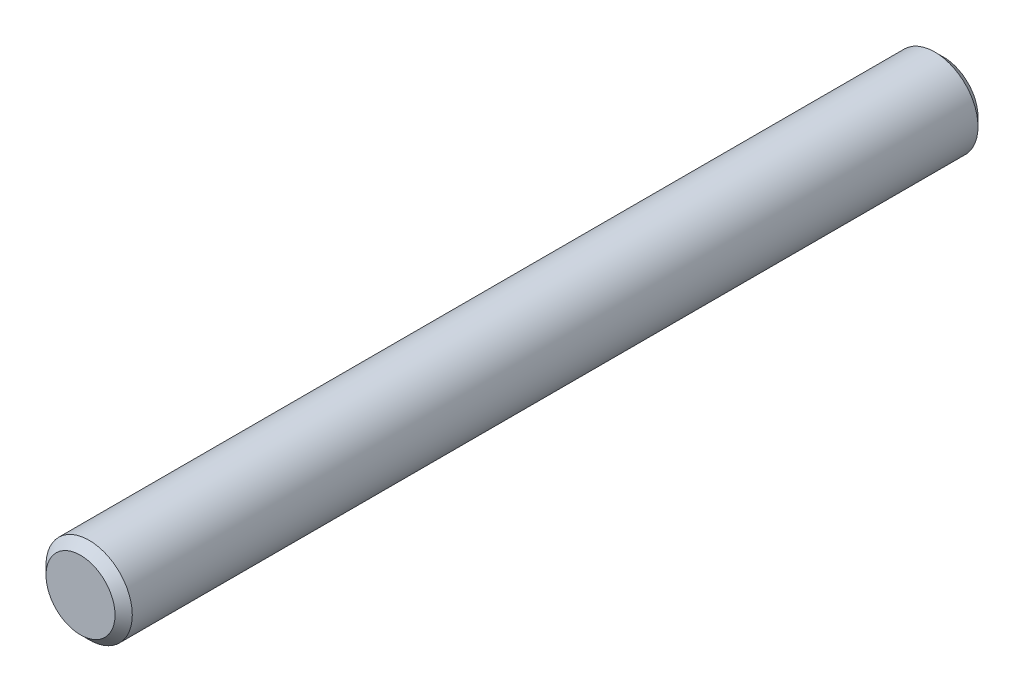
ISO-10303-21;
HEADER;
FILE_DESCRIPTION(('STEP AP214'),'2;1');
FILE_NAME('part.step','',(''),(''),'','','');
FILE_SCHEMA(('AUTOMOTIVE_DESIGN { 1 0 10303 214 1 1 1 1 }'));
ENDSEC;
DATA;
#1=APPLICATION_CONTEXT('core data for automotive mechanical design processes');
#2=APPLICATION_PROTOCOL_DEFINITION('international standard','automotive_design',2000,#1);
#3=PRODUCT_CONTEXT('',#1,'mechanical');
#4=PRODUCT('Part','Part','',(#3));
#5=PRODUCT_RELATED_PRODUCT_CATEGORY('part','',(#4));
#6=PRODUCT_DEFINITION_FORMATION('','',#4);
#7=PRODUCT_DEFINITION_CONTEXT('part definition',#1,'design');
#8=PRODUCT_DEFINITION('design','',#6,#7);
#9=PRODUCT_DEFINITION_SHAPE('','',#8);
#10=(LENGTH_UNIT() NAMED_UNIT(*) SI_UNIT(.MILLI.,.METRE.));
#11=(NAMED_UNIT(*) PLANE_ANGLE_UNIT() SI_UNIT($,.RADIAN.));
#12=(NAMED_UNIT(*) SI_UNIT($,.STERADIAN.) SOLID_ANGLE_UNIT());
#13=UNCERTAINTY_MEASURE_WITH_UNIT(LENGTH_MEASURE(1.E-05),#10,'distance_accuracy_value','');
#14=(GEOMETRIC_REPRESENTATION_CONTEXT(3) GLOBAL_UNCERTAINTY_ASSIGNED_CONTEXT((#13)) GLOBAL_UNIT_ASSIGNED_CONTEXT((#10,
#11,#12)) REPRESENTATION_CONTEXT('',''));
#15=CARTESIAN_POINT('',(0.,0.,0.));
#16=DIRECTION('',(0.,0.,1.));
#17=DIRECTION('',(1.,0.,0.));
#18=AXIS2_PLACEMENT_3D('',#15,#16,#17);
#19=CARTESIAN_POINT('',(0.,0.,6.35));
#20=DIRECTION('',(0.,0.,-1.));
#21=DIRECTION('',(-1.,0.,0.));
#22=AXIS2_PLACEMENT_3D('',#19,#20,#21);
#23=CYLINDRICAL_SURFACE('',#22,0.635);
#24=CARTESIAN_POINT('',(0.,0.,-6.223));
#25=DIRECTION('',(0.,0.,1.));
#26=DIRECTION('',(1.,0.,0.));
#27=AXIS2_PLACEMENT_3D('',#24,#25,#26);
#28=CIRCLE('',#27,0.635);
#29=CARTESIAN_POINT('',(0.635,0.,-6.223));
#30=VERTEX_POINT('',#29);
#31=EDGE_CURVE('E42',#30,#30,#28,.T.);
#32=ORIENTED_EDGE('',*,*,#31,.T.);
#33=EDGE_LOOP('',(#32));
#34=FACE_BOUND('',#33,.T.);
#35=CARTESIAN_POINT('',(0.,0.,6.223));
#36=DIRECTION('',(0.,0.,1.));
#37=DIRECTION('',(1.,0.,0.));
#38=AXIS2_PLACEMENT_3D('',#35,#36,#37);
#39=CIRCLE('',#38,0.635);
#40=CARTESIAN_POINT('',(0.635,0.,6.223));
#41=VERTEX_POINT('',#40);
#42=EDGE_CURVE('E46',#41,#41,#39,.F.);
#43=ORIENTED_EDGE('',*,*,#42,.T.);
#44=EDGE_LOOP('',(#43));
#45=FACE_BOUND('',#44,.T.);
#46=ADVANCED_FACE('F31',(#34,#45),#23,.T.);
#47=CARTESIAN_POINT('',(0.,0.,6.35));
#48=DIRECTION('',(0.,0.,1.));
#49=DIRECTION('',(1.,0.,0.));
#50=AXIS2_PLACEMENT_3D('',#47,#48,#49);
#51=PLANE('',#50);
#52=CARTESIAN_POINT('',(0.,0.,6.35));
#53=DIRECTION('',(0.,0.,1.));
#54=DIRECTION('',(1.,0.,0.));
#55=AXIS2_PLACEMENT_3D('',#52,#53,#54);
#56=CIRCLE('',#55,0.508);
#57=CARTESIAN_POINT('',(0.508,0.,6.35));
#58=VERTEX_POINT('',#57);
#59=EDGE_CURVE('E10',#58,#58,#56,.T.);
#60=ORIENTED_EDGE('',*,*,#59,.T.);
#61=EDGE_LOOP('',(#60));
#62=FACE_BOUND('',#61,.T.);
#63=ADVANCED_FACE('F62',(#62),#51,.T.);
#64=CARTESIAN_POINT('',(0.,0.,-6.35));
#65=DIRECTION('',(0.,0.,1.));
#66=DIRECTION('',(1.,0.,0.));
#67=AXIS2_PLACEMENT_3D('',#64,#65,#66);
#68=PLANE('',#67);
#69=CARTESIAN_POINT('',(0.,0.,-6.35));
#70=DIRECTION('',(0.,0.,1.));
#71=DIRECTION('',(1.,0.,0.));
#72=AXIS2_PLACEMENT_3D('',#69,#70,#71);
#73=CIRCLE('',#72,0.508);
#74=CARTESIAN_POINT('',(0.508,0.,-6.35));
#75=VERTEX_POINT('',#74);
#76=EDGE_CURVE('E38',#75,#75,#73,.F.);
#77=ORIENTED_EDGE('',*,*,#76,.T.);
#78=EDGE_LOOP('',(#77));
#79=FACE_BOUND('',#78,.T.);
#80=ADVANCED_FACE('F59',(#79),#68,.F.);
#81=CARTESIAN_POINT('',(0.,0.,-6.223));
#82=DIRECTION('',(0.,0.,1.));
#83=DIRECTION('',(1.,0.,0.));
#84=AXIS2_PLACEMENT_3D('',#81,#82,#83);
#85=CONICAL_SURFACE('',#84,0.635,0.785398163397455);
#86=ORIENTED_EDGE('',*,*,#76,.F.);
#87=EDGE_LOOP('',(#86));
#88=FACE_BOUND('',#87,.T.);
#89=ORIENTED_EDGE('',*,*,#31,.F.);
#90=EDGE_LOOP('',(#89));
#91=FACE_BOUND('',#90,.T.);
#92=ADVANCED_FACE('F55',(#88,#91),#85,.T.);
#93=CARTESIAN_POINT('',(0.,0.,6.35));
#94=DIRECTION('',(0.,0.,-1.));
#95=DIRECTION('',(-1.,0.,0.));
#96=AXIS2_PLACEMENT_3D('',#93,#94,#95);
#97=CONICAL_SURFACE('',#96,0.508,0.785398163397445);
#98=ORIENTED_EDGE('',*,*,#42,.F.);
#99=EDGE_LOOP('',(#98));
#100=FACE_BOUND('',#99,.T.);
#101=ORIENTED_EDGE('',*,*,#59,.F.);
#102=EDGE_LOOP('',(#101));
#103=FACE_BOUND('',#102,.T.);
#104=ADVANCED_FACE('F33',(#100,#103),#97,.T.);
#105=CLOSED_SHELL('',(#46,#63,#80,#92,#104));
#106=MANIFOLD_SOLID_BREP('B2',#105);
#107=ADVANCED_BREP_SHAPE_REPRESENTATION('',(#18,#106),#14);
#108=SHAPE_DEFINITION_REPRESENTATION(#9,#107);
ENDSEC;
END-ISO-10303-21;
